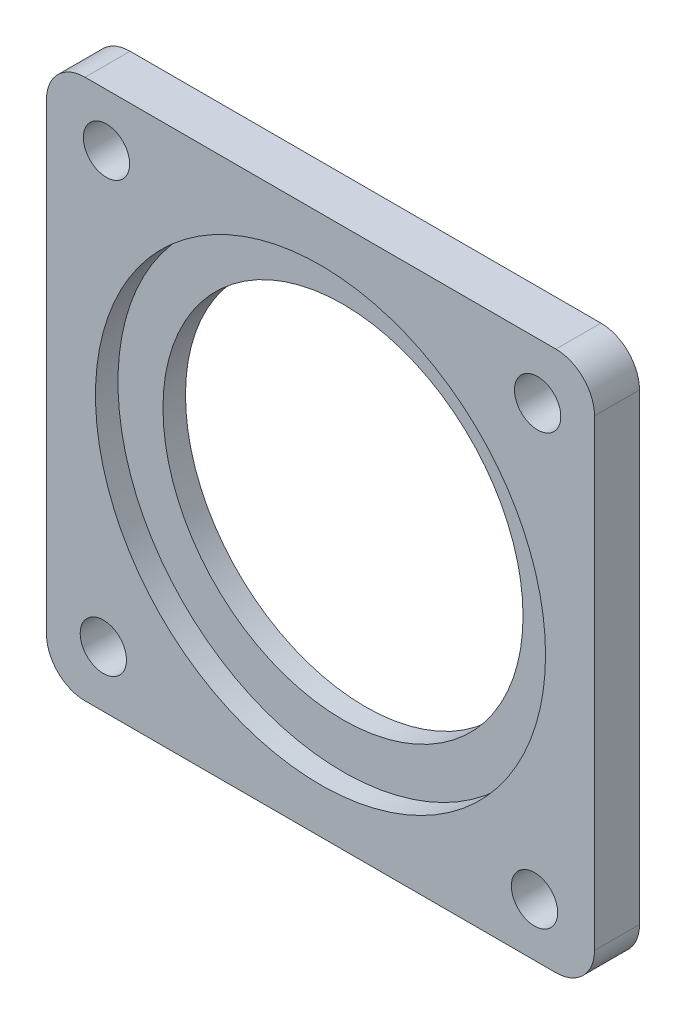
ISO-10303-21;
HEADER;
FILE_DESCRIPTION(('STEP AP214'),'2;1');
FILE_NAME('part.step','',(''),(''),'','','');
FILE_SCHEMA(('AUTOMOTIVE_DESIGN { 1 0 10303 214 1 1 1 1 }'));
ENDSEC;
DATA;
#1=APPLICATION_CONTEXT('core data for automotive mechanical design processes');
#2=APPLICATION_PROTOCOL_DEFINITION('international standard','automotive_design',2000,#1);
#3=PRODUCT_CONTEXT('',#1,'mechanical');
#4=PRODUCT('Part','Part','',(#3));
#5=PRODUCT_RELATED_PRODUCT_CATEGORY('part','',(#4));
#6=PRODUCT_DEFINITION_FORMATION('','',#4);
#7=PRODUCT_DEFINITION_CONTEXT('part definition',#1,'design');
#8=PRODUCT_DEFINITION('design','',#6,#7);
#9=PRODUCT_DEFINITION_SHAPE('','',#8);
#10=(LENGTH_UNIT() NAMED_UNIT(*) SI_UNIT(.MILLI.,.METRE.));
#11=(NAMED_UNIT(*) PLANE_ANGLE_UNIT() SI_UNIT($,.RADIAN.));
#12=(NAMED_UNIT(*) SI_UNIT($,.STERADIAN.) SOLID_ANGLE_UNIT());
#13=UNCERTAINTY_MEASURE_WITH_UNIT(LENGTH_MEASURE(1.E-05),#10,'distance_accuracy_value','');
#14=(GEOMETRIC_REPRESENTATION_CONTEXT(3) GLOBAL_UNCERTAINTY_ASSIGNED_CONTEXT((#13)) GLOBAL_UNIT_ASSIGNED_CONTEXT((#10,
#11,#12)) REPRESENTATION_CONTEXT('',''));
#15=CARTESIAN_POINT('',(0.,0.,0.));
#16=DIRECTION('',(0.,0.,1.));
#17=DIRECTION('',(1.,0.,0.));
#18=AXIS2_PLACEMENT_3D('',#15,#16,#17);
#19=CARTESIAN_POINT('',(0.,0.,3.5));
#20=DIRECTION('',(0.,0.,-1.));
#21=DIRECTION('',(-1.,0.,0.));
#22=AXIS2_PLACEMENT_3D('',#19,#20,#21);
#23=CYLINDRICAL_SURFACE('',#22,14.);
#24=CARTESIAN_POINT('',(0.,0.,0.));
#25=DIRECTION('',(0.,0.,1.));
#26=DIRECTION('',(1.,0.,0.));
#27=AXIS2_PLACEMENT_3D('',#24,#25,#26);
#28=CIRCLE('',#27,14.);
#29=CARTESIAN_POINT('',(14.,0.,0.));
#30=VERTEX_POINT('',#29);
#31=EDGE_CURVE('E129',#30,#30,#28,.T.);
#32=ORIENTED_EDGE('',*,*,#31,.F.);
#33=EDGE_LOOP('',(#32));
#34=FACE_BOUND('',#33,.T.);
#35=CARTESIAN_POINT('',(0.,0.,1.75));
#36=DIRECTION('',(0.,0.,1.));
#37=DIRECTION('',(1.,0.,0.));
#38=AXIS2_PLACEMENT_3D('',#35,#36,#37);
#39=CIRCLE('',#38,14.);
#40=CARTESIAN_POINT('',(14.,0.,1.75));
#41=VERTEX_POINT('',#40);
#42=EDGE_CURVE('E135',#41,#41,#39,.T.);
#43=ORIENTED_EDGE('',*,*,#42,.T.);
#44=EDGE_LOOP('',(#43));
#45=FACE_BOUND('',#44,.T.);
#46=ADVANCED_FACE('F35',(#34,#45),#23,.F.);
#47=CARTESIAN_POINT('',(0.,0.,3.5));
#48=DIRECTION('',(0.,0.,1.));
#49=DIRECTION('',(1.,0.,0.));
#50=AXIS2_PLACEMENT_3D('',#47,#48,#49);
#51=PLANE('',#50);
#52=CARTESIAN_POINT('',(16.8856216883251,16.6420790678204,3.5));
#53=DIRECTION('',(0.,0.,-1.));
#54=DIRECTION('',(-1.,0.,0.));
#55=AXIS2_PLACEMENT_3D('',#52,#53,#54);
#56=CIRCLE('',#55,1.8);
#57=CARTESIAN_POINT('',(15.0856216883251,16.6420790678204,3.5));
#58=VERTEX_POINT('',#57);
#59=EDGE_CURVE('E208',#58,#58,#56,.T.);
#60=ORIENTED_EDGE('',*,*,#59,.T.);
#61=EDGE_LOOP('',(#60));
#62=FACE_BOUND('',#61,.T.);
#63=CARTESIAN_POINT('',(-16.6420790678204,16.8856216883261,3.5));
#64=DIRECTION('',(0.,0.,-1.));
#65=DIRECTION('',(-1.,0.,0.));
#66=AXIS2_PLACEMENT_3D('',#63,#64,#65);
#67=CIRCLE('',#66,1.8);
#68=CARTESIAN_POINT('',(-18.4420790678204,16.8856216883261,3.5));
#69=VERTEX_POINT('',#68);
#70=EDGE_CURVE('E202',#69,#69,#67,.T.);
#71=ORIENTED_EDGE('',*,*,#70,.T.);
#72=EDGE_LOOP('',(#71));
#73=FACE_BOUND('',#72,.T.);
#74=CARTESIAN_POINT('',(-16.8856216883261,-16.6420790678195,3.5));
#75=DIRECTION('',(0.,0.,-1.));
#76=DIRECTION('',(-1.,0.,0.));
#77=AXIS2_PLACEMENT_3D('',#74,#75,#76);
#78=CIRCLE('',#77,1.8);
#79=CARTESIAN_POINT('',(-18.6856216883261,-16.6420790678195,3.5));
#80=VERTEX_POINT('',#79);
#81=EDGE_CURVE('E196',#80,#80,#78,.T.);
#82=ORIENTED_EDGE('',*,*,#81,.T.);
#83=EDGE_LOOP('',(#82));
#84=FACE_BOUND('',#83,.T.);
#85=CARTESIAN_POINT('',(16.6420790678195,-16.8856216883251,3.5));
#86=DIRECTION('',(0.,0.,-1.));
#87=DIRECTION('',(-1.,0.,0.));
#88=AXIS2_PLACEMENT_3D('',#85,#86,#87);
#89=CIRCLE('',#88,1.8);
#90=CARTESIAN_POINT('',(14.8420790678195,-16.8856216883251,3.5));
#91=VERTEX_POINT('',#90);
#92=EDGE_CURVE('E188',#91,#91,#89,.T.);
#93=ORIENTED_EDGE('',*,*,#92,.T.);
#94=EDGE_LOOP('',(#93));
#95=FACE_BOUND('',#94,.T.);
#96=CARTESIAN_POINT('',(0.,0.,3.5));
#97=DIRECTION('',(0.,0.,1.));
#98=DIRECTION('',(1.,0.,0.));
#99=AXIS2_PLACEMENT_3D('',#96,#97,#98);
#100=CIRCLE('',#99,17.5);
#101=CARTESIAN_POINT('',(17.5,0.,3.5));
#102=VERTEX_POINT('',#101);
#103=EDGE_CURVE('E185',#102,#102,#100,.T.);
#104=ORIENTED_EDGE('',*,*,#103,.F.);
#105=EDGE_LOOP('',(#104));
#106=FACE_BOUND('',#105,.T.);
#107=DIRECTION('',(-1.,0.,0.));
#108=VECTOR('',#107,1.);
#109=CARTESIAN_POINT('',(21.3073170731708,21.,3.5));
#110=LINE('',#109,#108);
#111=CARTESIAN_POINT('',(18.3073170731708,21.,3.5));
#112=VERTEX_POINT('',#111);
#113=CARTESIAN_POINT('',(-18.3073170731708,21.,3.5));
#114=VERTEX_POINT('',#113);
#115=EDGE_CURVE('E138',#112,#114,#110,.T.);
#116=ORIENTED_EDGE('',*,*,#115,.T.);
#117=CARTESIAN_POINT('',(-18.3073170731708,18.,3.5));
#118=DIRECTION('',(0.,0.,1.));
#119=DIRECTION('',(1.,0.,0.));
#120=AXIS2_PLACEMENT_3D('',#117,#118,#119);
#121=CIRCLE('',#120,3.);
#122=CARTESIAN_POINT('',(-21.3073170731708,18.,3.5));
#123=VERTEX_POINT('',#122);
#124=EDGE_CURVE('E160',#114,#123,#121,.T.);
#125=ORIENTED_EDGE('',*,*,#124,.T.);
#126=DIRECTION('',(0.,-1.,0.));
#127=VECTOR('',#126,1.);
#128=CARTESIAN_POINT('',(-21.3073170731708,-21.,3.5));
#129=LINE('',#128,#127);
#130=CARTESIAN_POINT('',(-21.3073170731708,-18.,3.5));
#131=VERTEX_POINT('',#130);
#132=EDGE_CURVE('E121',#123,#131,#129,.T.);
#133=ORIENTED_EDGE('',*,*,#132,.T.);
#134=CARTESIAN_POINT('',(-18.3073170731708,-18.,3.5));
#135=DIRECTION('',(0.,0.,1.));
#136=DIRECTION('',(1.,0.,0.));
#137=AXIS2_PLACEMENT_3D('',#134,#135,#136);
#138=CIRCLE('',#137,3.);
#139=CARTESIAN_POINT('',(-18.3073170731708,-21.,3.5));
#140=VERTEX_POINT('',#139);
#141=EDGE_CURVE('E158',#131,#140,#138,.T.);
#142=ORIENTED_EDGE('',*,*,#141,.T.);
#143=DIRECTION('',(1.,0.,0.));
#144=VECTOR('',#143,1.);
#145=CARTESIAN_POINT('',(21.3073170731708,-21.,3.5));
#146=LINE('',#145,#144);
#147=CARTESIAN_POINT('',(18.3073170731708,-21.,3.5));
#148=VERTEX_POINT('',#147);
#149=EDGE_CURVE('E171',#140,#148,#146,.T.);
#150=ORIENTED_EDGE('',*,*,#149,.T.);
#151=CARTESIAN_POINT('',(18.3073170731708,-18.,3.5));
#152=DIRECTION('',(0.,0.,1.));
#153=DIRECTION('',(1.,0.,0.));
#154=AXIS2_PLACEMENT_3D('',#151,#152,#153);
#155=CIRCLE('',#154,3.);
#156=CARTESIAN_POINT('',(21.3073170731708,-18.,3.5));
#157=VERTEX_POINT('',#156);
#158=EDGE_CURVE('E56',#148,#157,#155,.T.);
#159=ORIENTED_EDGE('',*,*,#158,.T.);
#160=DIRECTION('',(0.,1.,0.));
#161=VECTOR('',#160,1.);
#162=CARTESIAN_POINT('',(21.3073170731708,-21.,3.5));
#163=LINE('',#162,#161);
#164=CARTESIAN_POINT('',(21.3073170731708,18.,3.5));
#165=VERTEX_POINT('',#164);
#166=EDGE_CURVE('E179',#157,#165,#163,.T.);
#167=ORIENTED_EDGE('',*,*,#166,.T.);
#168=CARTESIAN_POINT('',(18.3073170731708,18.,3.5));
#169=DIRECTION('',(0.,0.,1.));
#170=DIRECTION('',(1.,0.,0.));
#171=AXIS2_PLACEMENT_3D('',#168,#169,#170);
#172=CIRCLE('',#171,3.);
#173=EDGE_CURVE('E155',#165,#112,#172,.T.);
#174=ORIENTED_EDGE('',*,*,#173,.T.);
#175=EDGE_LOOP('',(#116,#125,#133,#142,#150,#159,#167,#174));
#176=FACE_BOUND('',#175,.T.);
#177=ADVANCED_FACE('F219',(#62,#73,#84,#95,#106,#176),#51,.T.);
#178=CARTESIAN_POINT('',(0.,0.,0.));
#179=DIRECTION('',(0.,0.,1.));
#180=DIRECTION('',(1.,0.,0.));
#181=AXIS2_PLACEMENT_3D('',#178,#179,#180);
#182=PLANE('',#181);
#183=CARTESIAN_POINT('',(16.8856216883251,16.6420790678204,0.));
#184=DIRECTION('',(0.,0.,-1.));
#185=DIRECTION('',(-1.,0.,0.));
#186=AXIS2_PLACEMENT_3D('',#183,#184,#185);
#187=CIRCLE('',#186,1.8);
#188=CARTESIAN_POINT('',(15.0856216883251,16.6420790678204,0.));
#189=VERTEX_POINT('',#188);
#190=EDGE_CURVE('E211',#189,#189,#187,.T.);
#191=ORIENTED_EDGE('',*,*,#190,.F.);
#192=EDGE_LOOP('',(#191));
#193=FACE_BOUND('',#192,.T.);
#194=CARTESIAN_POINT('',(-16.6420790678204,16.8856216883261,0.));
#195=DIRECTION('',(0.,0.,-1.));
#196=DIRECTION('',(-1.,0.,0.));
#197=AXIS2_PLACEMENT_3D('',#194,#195,#196);
#198=CIRCLE('',#197,1.8);
#199=CARTESIAN_POINT('',(-18.4420790678204,16.8856216883261,0.));
#200=VERTEX_POINT('',#199);
#201=EDGE_CURVE('E205',#200,#200,#198,.T.);
#202=ORIENTED_EDGE('',*,*,#201,.F.);
#203=EDGE_LOOP('',(#202));
#204=FACE_BOUND('',#203,.T.);
#205=CARTESIAN_POINT('',(-16.8856216883261,-16.6420790678195,0.));
#206=DIRECTION('',(0.,0.,-1.));
#207=DIRECTION('',(-1.,0.,0.));
#208=AXIS2_PLACEMENT_3D('',#205,#206,#207);
#209=CIRCLE('',#208,1.8);
#210=CARTESIAN_POINT('',(-18.6856216883261,-16.6420790678195,0.));
#211=VERTEX_POINT('',#210);
#212=EDGE_CURVE('E199',#211,#211,#209,.T.);
#213=ORIENTED_EDGE('',*,*,#212,.F.);
#214=EDGE_LOOP('',(#213));
#215=FACE_BOUND('',#214,.T.);
#216=CARTESIAN_POINT('',(16.6420790678195,-16.8856216883251,0.));
#217=DIRECTION('',(0.,0.,-1.));
#218=DIRECTION('',(-1.,0.,0.));
#219=AXIS2_PLACEMENT_3D('',#216,#217,#218);
#220=CIRCLE('',#219,1.8);
#221=CARTESIAN_POINT('',(14.8420790678195,-16.8856216883251,0.));
#222=VERTEX_POINT('',#221);
#223=EDGE_CURVE('E193',#222,#222,#220,.T.);
#224=ORIENTED_EDGE('',*,*,#223,.F.);
#225=EDGE_LOOP('',(#224));
#226=FACE_BOUND('',#225,.T.);
#227=DIRECTION('',(0.,-1.,0.));
#228=VECTOR('',#227,1.);
#229=CARTESIAN_POINT('',(-21.3073170731708,-21.,0.));
#230=LINE('',#229,#228);
#231=CARTESIAN_POINT('',(-21.3073170731708,18.,0.));
#232=VERTEX_POINT('',#231);
#233=CARTESIAN_POINT('',(-21.3073170731708,-18.,0.));
#234=VERTEX_POINT('',#233);
#235=EDGE_CURVE('E118',#232,#234,#230,.T.);
#236=ORIENTED_EDGE('',*,*,#235,.F.);
#237=CARTESIAN_POINT('',(-18.3073170731708,18.,0.));
#238=DIRECTION('',(0.,0.,1.));
#239=DIRECTION('',(1.,0.,0.));
#240=AXIS2_PLACEMENT_3D('',#237,#238,#239);
#241=CIRCLE('',#240,3.);
#242=CARTESIAN_POINT('',(-18.3073170731708,21.,0.));
#243=VERTEX_POINT('',#242);
#244=EDGE_CURVE('E101',#232,#243,#241,.F.);
#245=ORIENTED_EDGE('',*,*,#244,.T.);
#246=DIRECTION('',(-1.,0.,0.));
#247=VECTOR('',#246,1.);
#248=CARTESIAN_POINT('',(21.3073170731708,21.,0.));
#249=LINE('',#248,#247);
#250=CARTESIAN_POINT('',(18.3073170731708,21.,0.));
#251=VERTEX_POINT('',#250);
#252=EDGE_CURVE('E142',#251,#243,#249,.T.);
#253=ORIENTED_EDGE('',*,*,#252,.F.);
#254=CARTESIAN_POINT('',(18.3073170731708,18.,0.));
#255=DIRECTION('',(0.,0.,1.));
#256=DIRECTION('',(1.,0.,0.));
#257=AXIS2_PLACEMENT_3D('',#254,#255,#256);
#258=CIRCLE('',#257,3.);
#259=CARTESIAN_POINT('',(21.3073170731708,18.,0.));
#260=VERTEX_POINT('',#259);
#261=EDGE_CURVE('E122',#251,#260,#258,.F.);
#262=ORIENTED_EDGE('',*,*,#261,.T.);
#263=DIRECTION('',(0.,1.,0.));
#264=VECTOR('',#263,1.);
#265=CARTESIAN_POINT('',(21.3073170731708,-21.,0.));
#266=LINE('',#265,#264);
#267=CARTESIAN_POINT('',(21.3073170731708,-18.,0.));
#268=VERTEX_POINT('',#267);
#269=EDGE_CURVE('E132',#268,#260,#266,.T.);
#270=ORIENTED_EDGE('',*,*,#269,.F.);
#271=CARTESIAN_POINT('',(18.3073170731708,-18.,0.));
#272=DIRECTION('',(0.,0.,1.));
#273=DIRECTION('',(1.,0.,0.));
#274=AXIS2_PLACEMENT_3D('',#271,#272,#273);
#275=CIRCLE('',#274,3.);
#276=CARTESIAN_POINT('',(18.3073170731708,-21.,0.));
#277=VERTEX_POINT('',#276);
#278=EDGE_CURVE('E149',#268,#277,#275,.F.);
#279=ORIENTED_EDGE('',*,*,#278,.T.);
#280=DIRECTION('',(1.,0.,0.));
#281=VECTOR('',#280,1.);
#282=CARTESIAN_POINT('',(21.3073170731708,-21.,0.));
#283=LINE('',#282,#281);
#284=CARTESIAN_POINT('',(-18.3073170731708,-21.,0.));
#285=VERTEX_POINT('',#284);
#286=EDGE_CURVE('E128',#285,#277,#283,.T.);
#287=ORIENTED_EDGE('',*,*,#286,.F.);
#288=CARTESIAN_POINT('',(-18.3073170731708,-18.,0.));
#289=DIRECTION('',(0.,0.,1.));
#290=DIRECTION('',(1.,0.,0.));
#291=AXIS2_PLACEMENT_3D('',#288,#289,#290);
#292=CIRCLE('',#291,3.);
#293=EDGE_CURVE('E112',#285,#234,#292,.F.);
#294=ORIENTED_EDGE('',*,*,#293,.T.);
#295=EDGE_LOOP('',(#236,#245,#253,#262,#270,#279,#287,#294));
#296=FACE_BOUND('',#295,.T.);
#297=ORIENTED_EDGE('',*,*,#31,.T.);
#298=EDGE_LOOP('',(#297));
#299=FACE_BOUND('',#298,.T.);
#300=ADVANCED_FACE('F125',(#193,#204,#215,#226,#296,#299),#182,.F.);
#301=CARTESIAN_POINT('',(-21.3073170731708,-21.,3.5));
#302=DIRECTION('',(1.,0.,0.));
#303=DIRECTION('',(0.,0.,-1.));
#304=AXIS2_PLACEMENT_3D('',#301,#302,#303);
#305=PLANE('',#304);
#306=ORIENTED_EDGE('',*,*,#132,.F.);
#307=DIRECTION('',(0.,0.,-1.));
#308=VECTOR('',#307,1.);
#309=CARTESIAN_POINT('',(-21.3073170731708,18.,3.5));
#310=LINE('',#309,#308);
#311=EDGE_CURVE('E105',#123,#232,#310,.T.);
#312=ORIENTED_EDGE('',*,*,#311,.T.);
#313=ORIENTED_EDGE('',*,*,#235,.T.);
#314=DIRECTION('',(0.,0.,-1.));
#315=VECTOR('',#314,1.);
#316=CARTESIAN_POINT('',(-21.3073170731708,-18.,3.5));
#317=LINE('',#316,#315);
#318=EDGE_CURVE('E123',#234,#131,#317,.F.);
#319=ORIENTED_EDGE('',*,*,#318,.T.);
#320=EDGE_LOOP('',(#306,#312,#313,#319));
#321=FACE_BOUND('',#320,.T.);
#322=ADVANCED_FACE('F117',(#321),#305,.F.);
#323=CARTESIAN_POINT('',(21.3073170731708,-21.,3.5));
#324=DIRECTION('',(0.,1.,0.));
#325=DIRECTION('',(-1.,0.,0.));
#326=AXIS2_PLACEMENT_3D('',#323,#324,#325);
#327=PLANE('',#326);
#328=ORIENTED_EDGE('',*,*,#149,.F.);
#329=DIRECTION('',(0.,0.,-1.));
#330=VECTOR('',#329,1.);
#331=CARTESIAN_POINT('',(-18.3073170731708,-21.,3.5));
#332=LINE('',#331,#330);
#333=EDGE_CURVE('E164',#140,#285,#332,.T.);
#334=ORIENTED_EDGE('',*,*,#333,.T.);
#335=ORIENTED_EDGE('',*,*,#286,.T.);
#336=DIRECTION('',(0.,0.,-1.));
#337=VECTOR('',#336,1.);
#338=CARTESIAN_POINT('',(18.3073170731708,-21.,3.5));
#339=LINE('',#338,#337);
#340=EDGE_CURVE('E162',#277,#148,#339,.F.);
#341=ORIENTED_EDGE('',*,*,#340,.T.);
#342=EDGE_LOOP('',(#328,#334,#335,#341));
#343=FACE_BOUND('',#342,.T.);
#344=ADVANCED_FACE('F169',(#343),#327,.F.);
#345=CARTESIAN_POINT('',(21.3073170731708,-21.,3.5));
#346=DIRECTION('',(-1.,0.,0.));
#347=DIRECTION('',(0.,0.,1.));
#348=AXIS2_PLACEMENT_3D('',#345,#346,#347);
#349=PLANE('',#348);
#350=ORIENTED_EDGE('',*,*,#166,.F.);
#351=DIRECTION('',(0.,0.,-1.));
#352=VECTOR('',#351,1.);
#353=CARTESIAN_POINT('',(21.3073170731708,-18.,3.5));
#354=LINE('',#353,#352);
#355=EDGE_CURVE('E11',#157,#268,#354,.T.);
#356=ORIENTED_EDGE('',*,*,#355,.T.);
#357=ORIENTED_EDGE('',*,*,#269,.T.);
#358=DIRECTION('',(0.,0.,-1.));
#359=VECTOR('',#358,1.);
#360=CARTESIAN_POINT('',(21.3073170731708,18.,3.5));
#361=LINE('',#360,#359);
#362=EDGE_CURVE('E43',#260,#165,#361,.F.);
#363=ORIENTED_EDGE('',*,*,#362,.T.);
#364=EDGE_LOOP('',(#350,#356,#357,#363));
#365=FACE_BOUND('',#364,.T.);
#366=ADVANCED_FACE('F178',(#365),#349,.F.);
#367=CARTESIAN_POINT('',(21.3073170731708,21.,3.5));
#368=DIRECTION('',(0.,-1.,0.));
#369=DIRECTION('',(1.,0.,0.));
#370=AXIS2_PLACEMENT_3D('',#367,#368,#369);
#371=PLANE('',#370);
#372=ORIENTED_EDGE('',*,*,#252,.T.);
#373=DIRECTION('',(0.,0.,-1.));
#374=VECTOR('',#373,1.);
#375=CARTESIAN_POINT('',(-18.3073170731708,21.,3.5));
#376=LINE('',#375,#374);
#377=EDGE_CURVE('E106',#243,#114,#376,.F.);
#378=ORIENTED_EDGE('',*,*,#377,.T.);
#379=ORIENTED_EDGE('',*,*,#115,.F.);
#380=DIRECTION('',(0.,0.,-1.));
#381=VECTOR('',#380,1.);
#382=CARTESIAN_POINT('',(18.3073170731708,21.,3.5));
#383=LINE('',#382,#381);
#384=EDGE_CURVE('E111',#112,#251,#383,.T.);
#385=ORIENTED_EDGE('',*,*,#384,.T.);
#386=EDGE_LOOP('',(#372,#378,#379,#385));
#387=FACE_BOUND('',#386,.T.);
#388=ADVANCED_FACE('F256',(#387),#371,.F.);
#389=CARTESIAN_POINT('',(0.,0.,1.75));
#390=DIRECTION('',(0.,0.,1.));
#391=DIRECTION('',(1.,0.,0.));
#392=AXIS2_PLACEMENT_3D('',#389,#390,#391);
#393=CYLINDRICAL_SURFACE('',#392,17.5);
#394=CARTESIAN_POINT('',(0.,0.,1.75));
#395=DIRECTION('',(0.,0.,1.));
#396=DIRECTION('',(1.,0.,0.));
#397=AXIS2_PLACEMENT_3D('',#394,#395,#396);
#398=CIRCLE('',#397,17.5);
#399=CARTESIAN_POINT('',(17.5,0.,1.75));
#400=VERTEX_POINT('',#399);
#401=EDGE_CURVE('E146',#400,#400,#398,.T.);
#402=ORIENTED_EDGE('',*,*,#401,.F.);
#403=EDGE_LOOP('',(#402));
#404=FACE_BOUND('',#403,.T.);
#405=ORIENTED_EDGE('',*,*,#103,.T.);
#406=EDGE_LOOP('',(#405));
#407=FACE_BOUND('',#406,.T.);
#408=ADVANCED_FACE('F240',(#404,#407),#393,.F.);
#409=CARTESIAN_POINT('',(0.,0.,1.75));
#410=DIRECTION('',(0.,0.,1.));
#411=DIRECTION('',(1.,0.,0.));
#412=AXIS2_PLACEMENT_3D('',#409,#410,#411);
#413=PLANE('',#412);
#414=ORIENTED_EDGE('',*,*,#42,.F.);
#415=EDGE_LOOP('',(#414));
#416=FACE_BOUND('',#415,.T.);
#417=ORIENTED_EDGE('',*,*,#401,.T.);
#418=EDGE_LOOP('',(#417));
#419=FACE_BOUND('',#418,.T.);
#420=ADVANCED_FACE('F230',(#416,#419),#413,.T.);
#421=CARTESIAN_POINT('',(16.6420790678195,-16.8856216883251,0.));
#422=DIRECTION('',(0.,0.,-1.));
#423=DIRECTION('',(-1.,0.,0.));
#424=AXIS2_PLACEMENT_3D('',#421,#422,#423);
#425=CYLINDRICAL_SURFACE('',#424,1.8);
#426=ORIENTED_EDGE('',*,*,#92,.F.);
#427=EDGE_LOOP('',(#426));
#428=FACE_BOUND('',#427,.T.);
#429=ORIENTED_EDGE('',*,*,#223,.T.);
#430=EDGE_LOOP('',(#429));
#431=FACE_BOUND('',#430,.T.);
#432=ADVANCED_FACE('F227',(#428,#431),#425,.F.);
#433=CARTESIAN_POINT('',(-16.8856216883261,-16.6420790678195,0.));
#434=DIRECTION('',(0.,0.,-1.));
#435=DIRECTION('',(-1.,0.,0.));
#436=AXIS2_PLACEMENT_3D('',#433,#434,#435);
#437=CYLINDRICAL_SURFACE('',#436,1.8);
#438=ORIENTED_EDGE('',*,*,#81,.F.);
#439=EDGE_LOOP('',(#438));
#440=FACE_BOUND('',#439,.T.);
#441=ORIENTED_EDGE('',*,*,#212,.T.);
#442=EDGE_LOOP('',(#441));
#443=FACE_BOUND('',#442,.T.);
#444=ADVANCED_FACE('F229',(#440,#443),#437,.F.);
#445=CARTESIAN_POINT('',(-16.6420790678204,16.8856216883261,0.));
#446=DIRECTION('',(0.,0.,-1.));
#447=DIRECTION('',(-1.,0.,0.));
#448=AXIS2_PLACEMENT_3D('',#445,#446,#447);
#449=CYLINDRICAL_SURFACE('',#448,1.8);
#450=ORIENTED_EDGE('',*,*,#70,.F.);
#451=EDGE_LOOP('',(#450));
#452=FACE_BOUND('',#451,.T.);
#453=ORIENTED_EDGE('',*,*,#201,.T.);
#454=EDGE_LOOP('',(#453));
#455=FACE_BOUND('',#454,.T.);
#456=ADVANCED_FACE('F237',(#452,#455),#449,.F.);
#457=CARTESIAN_POINT('',(16.8856216883251,16.6420790678204,0.));
#458=DIRECTION('',(0.,0.,-1.));
#459=DIRECTION('',(-1.,0.,0.));
#460=AXIS2_PLACEMENT_3D('',#457,#458,#459);
#461=CYLINDRICAL_SURFACE('',#460,1.8);
#462=ORIENTED_EDGE('',*,*,#59,.F.);
#463=EDGE_LOOP('',(#462));
#464=FACE_BOUND('',#463,.T.);
#465=ORIENTED_EDGE('',*,*,#190,.T.);
#466=EDGE_LOOP('',(#465));
#467=FACE_BOUND('',#466,.T.);
#468=ADVANCED_FACE('F215',(#464,#467),#461,.F.);
#469=CARTESIAN_POINT('',(-18.3073170731708,18.,3.5));
#470=DIRECTION('',(0.,0.,-1.));
#471=DIRECTION('',(-1.,0.,0.));
#472=AXIS2_PLACEMENT_3D('',#469,#470,#471);
#473=CYLINDRICAL_SURFACE('',#472,3.);
#474=ORIENTED_EDGE('',*,*,#124,.F.);
#475=ORIENTED_EDGE('',*,*,#377,.F.);
#476=ORIENTED_EDGE('',*,*,#244,.F.);
#477=ORIENTED_EDGE('',*,*,#311,.F.);
#478=EDGE_LOOP('',(#474,#475,#476,#477));
#479=FACE_BOUND('',#478,.T.);
#480=ADVANCED_FACE('F104',(#479),#473,.T.);
#481=CARTESIAN_POINT('',(-18.3073170731708,-18.,3.5));
#482=DIRECTION('',(0.,0.,-1.));
#483=DIRECTION('',(-1.,0.,0.));
#484=AXIS2_PLACEMENT_3D('',#481,#482,#483);
#485=CYLINDRICAL_SURFACE('',#484,3.);
#486=ORIENTED_EDGE('',*,*,#141,.F.);
#487=ORIENTED_EDGE('',*,*,#318,.F.);
#488=ORIENTED_EDGE('',*,*,#293,.F.);
#489=ORIENTED_EDGE('',*,*,#333,.F.);
#490=EDGE_LOOP('',(#486,#487,#488,#489));
#491=FACE_BOUND('',#490,.T.);
#492=ADVANCED_FACE('F268',(#491),#485,.T.);
#493=CARTESIAN_POINT('',(18.3073170731708,-18.,3.5));
#494=DIRECTION('',(0.,0.,-1.));
#495=DIRECTION('',(-1.,0.,0.));
#496=AXIS2_PLACEMENT_3D('',#493,#494,#495);
#497=CYLINDRICAL_SURFACE('',#496,3.);
#498=ORIENTED_EDGE('',*,*,#158,.F.);
#499=ORIENTED_EDGE('',*,*,#340,.F.);
#500=ORIENTED_EDGE('',*,*,#278,.F.);
#501=ORIENTED_EDGE('',*,*,#355,.F.);
#502=EDGE_LOOP('',(#498,#499,#500,#501));
#503=FACE_BOUND('',#502,.T.);
#504=ADVANCED_FACE('F177',(#503),#497,.T.);
#505=CARTESIAN_POINT('',(18.3073170731708,18.,3.5));
#506=DIRECTION('',(0.,0.,-1.));
#507=DIRECTION('',(-1.,0.,0.));
#508=AXIS2_PLACEMENT_3D('',#505,#506,#507);
#509=CYLINDRICAL_SURFACE('',#508,3.);
#510=ORIENTED_EDGE('',*,*,#173,.F.);
#511=ORIENTED_EDGE('',*,*,#362,.F.);
#512=ORIENTED_EDGE('',*,*,#261,.F.);
#513=ORIENTED_EDGE('',*,*,#384,.F.);
#514=EDGE_LOOP('',(#510,#511,#512,#513));
#515=FACE_BOUND('',#514,.T.);
#516=ADVANCED_FACE('F37',(#515),#509,.T.);
#517=CLOSED_SHELL('',(#46,#177,#300,#322,#344,#366,#388,#408,#420,#432,#444,#456,#468,#480,#492,
#504,#516));
#518=MANIFOLD_SOLID_BREP('B2',#517);
#519=ADVANCED_BREP_SHAPE_REPRESENTATION('',(#18,#518),#14);
#520=SHAPE_DEFINITION_REPRESENTATION(#9,#519);
ENDSEC;
END-ISO-10303-21;
